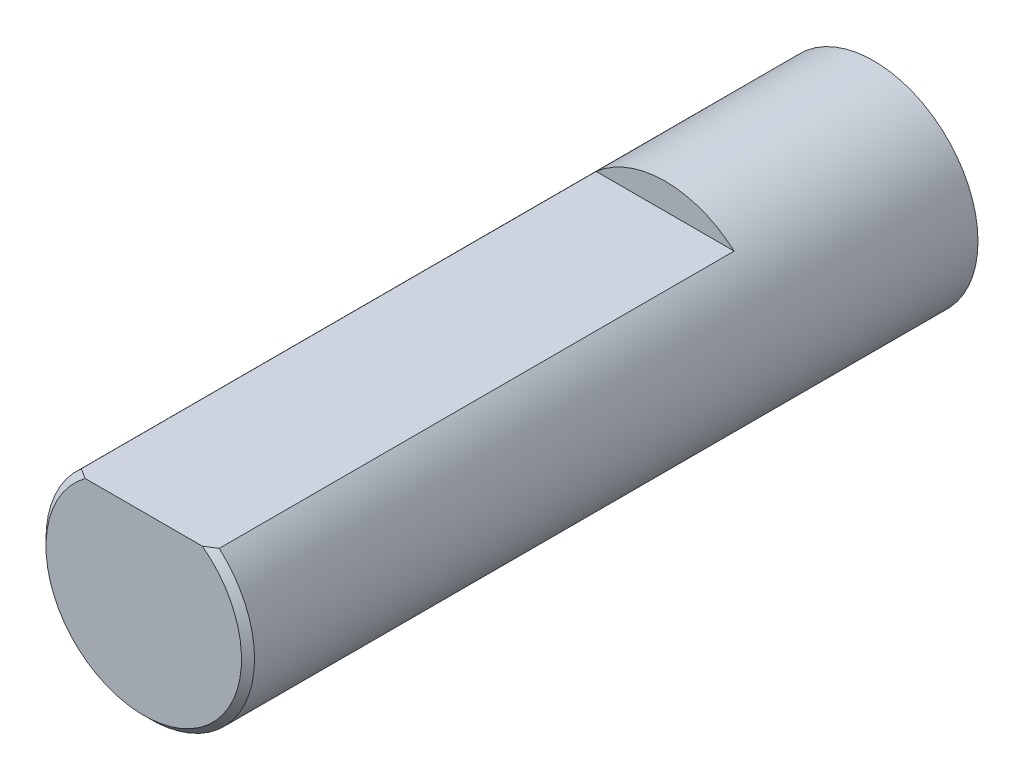
ISO-10303-21;
HEADER;
FILE_DESCRIPTION(('STEP AP214'),'2;1');
FILE_NAME('part.step','',(''),(''),'','','');
FILE_SCHEMA(('AUTOMOTIVE_DESIGN { 1 0 10303 214 1 1 1 1 }'));
ENDSEC;
DATA;
#1=APPLICATION_CONTEXT('core data for automotive mechanical design processes');
#2=APPLICATION_PROTOCOL_DEFINITION('international standard','automotive_design',2000,#1);
#3=PRODUCT_CONTEXT('',#1,'mechanical');
#4=PRODUCT('Part','Part','',(#3));
#5=PRODUCT_RELATED_PRODUCT_CATEGORY('part','',(#4));
#6=PRODUCT_DEFINITION_FORMATION('','',#4);
#7=PRODUCT_DEFINITION_CONTEXT('part definition',#1,'design');
#8=PRODUCT_DEFINITION('design','',#6,#7);
#9=PRODUCT_DEFINITION_SHAPE('','',#8);
#10=(LENGTH_UNIT() NAMED_UNIT(*) SI_UNIT(.MILLI.,.METRE.));
#11=(NAMED_UNIT(*) PLANE_ANGLE_UNIT() SI_UNIT($,.RADIAN.));
#12=(NAMED_UNIT(*) SI_UNIT($,.STERADIAN.) SOLID_ANGLE_UNIT());
#13=UNCERTAINTY_MEASURE_WITH_UNIT(LENGTH_MEASURE(1.E-05),#10,'distance_accuracy_value','');
#14=(GEOMETRIC_REPRESENTATION_CONTEXT(3) GLOBAL_UNCERTAINTY_ASSIGNED_CONTEXT((#13)) GLOBAL_UNIT_ASSIGNED_CONTEXT((#10,
#11,#12)) REPRESENTATION_CONTEXT('',''));
#15=CARTESIAN_POINT('',(0.,0.,0.));
#16=DIRECTION('',(0.,0.,1.));
#17=DIRECTION('',(1.,0.,0.));
#18=AXIS2_PLACEMENT_3D('',#15,#16,#17);
#19=CARTESIAN_POINT('',(0.,8.,-1.25));
#20=DIRECTION('',(0.,0.,1.));
#21=DIRECTION('',(1.,0.,0.));
#22=AXIS2_PLACEMENT_3D('',#19,#20,#21);
#23=PLANE('',#22);
#24=CARTESIAN_POINT('',(0.,8.,-1.25));
#25=DIRECTION('',(0.,0.,1.));
#26=DIRECTION('',(-1.,0.,0.));
#27=AXIS2_PLACEMENT_3D('',#24,#25,#26);
#28=CIRCLE('',#27,4.);
#29=CARTESIAN_POINT('',(4.,8.,-1.25));
#30=VERTEX_POINT('',#29);
#31=EDGE_CURVE('E37',#30,#30,#28,.T.);
#32=ORIENTED_EDGE('',*,*,#31,.F.);
#33=EDGE_LOOP('',(#32));
#34=FACE_BOUND('',#33,.T.);
#35=ADVANCED_FACE('F17',(#34),#23,.F.);
#36=CARTESIAN_POINT('',(0.,8.,26.75));
#37=DIRECTION('',(0.,0.,1.));
#38=DIRECTION('',(1.,0.,0.));
#39=AXIS2_PLACEMENT_3D('',#36,#37,#38);
#40=PLANE('',#39);
#41=CARTESIAN_POINT('',(0.,8.,26.75));
#42=DIRECTION('',(0.,0.,-1.));
#43=DIRECTION('',(-1.,0.,0.));
#44=AXIS2_PLACEMENT_3D('',#41,#42,#43);
#45=CIRCLE('',#44,3.75);
#46=CARTESIAN_POINT('',(2.25,11.,26.75));
#47=VERTEX_POINT('',#46);
#48=CARTESIAN_POINT('',(-2.25,11.,26.75));
#49=VERTEX_POINT('',#48);
#50=EDGE_CURVE('E90',#47,#49,#45,.T.);
#51=ORIENTED_EDGE('',*,*,#50,.F.);
#52=DIRECTION('',(-1.,0.,0.));
#53=VECTOR('',#52,1.);
#54=CARTESIAN_POINT('',(1.3228756555323,11.,26.75));
#55=LINE('',#54,#53);
#56=EDGE_CURVE('E11',#47,#49,#55,.T.);
#57=ORIENTED_EDGE('',*,*,#56,.T.);
#58=EDGE_LOOP('',(#51,#57));
#59=FACE_BOUND('',#58,.T.);
#60=ADVANCED_FACE('F134',(#59),#40,.T.);
#61=CARTESIAN_POINT('',(0.,11.5,6.75));
#62=DIRECTION('',(0.,0.,1.));
#63=DIRECTION('',(1.,0.,0.));
#64=AXIS2_PLACEMENT_3D('',#61,#62,#63);
#65=PLANE('',#64);
#66=DIRECTION('',(-1.,0.,0.));
#67=VECTOR('',#66,1.);
#68=CARTESIAN_POINT('',(-2.64575131106459,11.,6.75));
#69=LINE('',#68,#67);
#70=CARTESIAN_POINT('',(2.64575131106459,11.,6.75));
#71=VERTEX_POINT('',#70);
#72=CARTESIAN_POINT('',(-2.64575131106459,11.,6.75));
#73=VERTEX_POINT('',#72);
#74=EDGE_CURVE('E25',#71,#73,#69,.T.);
#75=ORIENTED_EDGE('',*,*,#74,.F.);
#76=CARTESIAN_POINT('',(0.,8.,6.75));
#77=DIRECTION('',(0.,0.,-1.));
#78=DIRECTION('',(-1.,0.,0.));
#79=AXIS2_PLACEMENT_3D('',#76,#77,#78);
#80=CIRCLE('',#79,4.);
#81=EDGE_CURVE('E77',#73,#71,#80,.T.);
#82=ORIENTED_EDGE('',*,*,#81,.F.);
#83=EDGE_LOOP('',(#75,#82));
#84=FACE_BOUND('',#83,.T.);
#85=ADVANCED_FACE('F117',(#84),#65,.T.);
#86=CARTESIAN_POINT('',(2.64575131106459,11.,26.75));
#87=DIRECTION('',(0.,-1.,0.));
#88=DIRECTION('',(0.,0.,-1.));
#89=AXIS2_PLACEMENT_3D('',#86,#87,#88);
#90=PLANE('',#89);
#91=CARTESIAN_POINT('',(2.64575131106459,11.,26.5));
#92=CARTESIAN_POINT('',(2.44149256986979,11.,26.6351044580781));
#93=CARTESIAN_POINT('',(2.25,11.,26.75));
#94=(BOUNDED_CURVE() B_SPLINE_CURVE(2,(#91,#92,#93),.UNSPECIFIED.,.F.,
.F.) B_SPLINE_CURVE_WITH_KNOTS((3,3),(2.79938337408154,2.92421286699696),
.UNSPECIFIED.) CURVE() GEOMETRIC_REPRESENTATION_ITEM() RATIONAL_B_SPLINE_CURVE((1.04757370527809,
1.02484755078438,1.)) REPRESENTATION_ITEM(''));
#95=CARTESIAN_POINT('',(2.64575131106459,11.,26.5));
#96=VERTEX_POINT('',#95);
#97=EDGE_CURVE('E83',#96,#47,#94,.T.);
#98=ORIENTED_EDGE('',*,*,#97,.F.);
#99=DIRECTION('',(0.,0.,1.));
#100=VECTOR('',#99,1.);
#101=CARTESIAN_POINT('',(2.64575131106459,11.,-1.25));
#102=LINE('',#101,#100);
#103=EDGE_CURVE('E69',#71,#96,#102,.T.);
#104=ORIENTED_EDGE('',*,*,#103,.F.);
#105=ORIENTED_EDGE('',*,*,#74,.T.);
#106=DIRECTION('',(0.,0.,-1.));
#107=VECTOR('',#106,1.);
#108=CARTESIAN_POINT('',(-2.64575131106459,11.,-1.25));
#109=LINE('',#108,#107);
#110=CARTESIAN_POINT('',(-2.64575131106459,11.,26.5));
#111=VERTEX_POINT('',#110);
#112=EDGE_CURVE('E106',#111,#73,#109,.T.);
#113=ORIENTED_EDGE('',*,*,#112,.F.);
#114=CARTESIAN_POINT('',(-2.25,11.,26.75));
#115=CARTESIAN_POINT('',(-2.44149256986996,11.,26.635104458078));
#116=CARTESIAN_POINT('',(-2.64575131106459,11.,26.5));
#117=(BOUNDED_CURVE() B_SPLINE_CURVE(2,(#114,#115,#116),.UNSPECIFIED.,.F.,
.F.) B_SPLINE_CURVE_WITH_KNOTS((3,3),(0.,0.124829492915321),
.UNSPECIFIED.) CURVE() GEOMETRIC_REPRESENTATION_ITEM() RATIONAL_B_SPLINE_CURVE((1.,
1.02484755078436,1.04757370527805)) REPRESENTATION_ITEM(''));
#118=EDGE_CURVE('E100',#49,#111,#117,.T.);
#119=ORIENTED_EDGE('',*,*,#118,.F.);
#120=ORIENTED_EDGE('',*,*,#56,.F.);
#121=EDGE_LOOP('',(#98,#104,#105,#113,#119,#120));
#122=FACE_BOUND('',#121,.T.);
#123=ADVANCED_FACE('F84',(#122),#90,.F.);
#124=CARTESIAN_POINT('',(0.,8.,-1.25));
#125=DIRECTION('',(0.,0.,1.));
#126=DIRECTION('',(-1.,0.,0.));
#127=AXIS2_PLACEMENT_3D('',#124,#125,#126);
#128=CYLINDRICAL_SURFACE('',#127,4.);
#129=CARTESIAN_POINT('',(0.,8.,26.5));
#130=DIRECTION('',(0.,0.,1.));
#131=DIRECTION('',(-1.,0.,0.));
#132=AXIS2_PLACEMENT_3D('',#129,#130,#131);
#133=CIRCLE('',#132,4.);
#134=CARTESIAN_POINT('',(4.,8.,26.5));
#135=VERTEX_POINT('',#134);
#136=EDGE_CURVE('E94',#111,#135,#133,.T.);
#137=ORIENTED_EDGE('',*,*,#136,.F.);
#138=ORIENTED_EDGE('',*,*,#112,.T.);
#139=ORIENTED_EDGE('',*,*,#81,.T.);
#140=ORIENTED_EDGE('',*,*,#103,.T.);
#141=CARTESIAN_POINT('',(0.,8.,26.5));
#142=DIRECTION('',(0.,0.,1.));
#143=DIRECTION('',(-1.,0.,0.));
#144=AXIS2_PLACEMENT_3D('',#141,#142,#143);
#145=CIRCLE('',#144,4.);
#146=EDGE_CURVE('E74',#135,#96,#145,.T.);
#147=ORIENTED_EDGE('',*,*,#146,.F.);
#148=DIRECTION('',(0.,0.,-1.));
#149=VECTOR('',#148,1.);
#150=CARTESIAN_POINT('',(4.,8.,-1.25));
#151=LINE('',#150,#149);
#152=EDGE_CURVE('E80',#135,#30,#151,.T.);
#153=ORIENTED_EDGE('',*,*,#152,.T.);
#154=ORIENTED_EDGE('',*,*,#31,.T.);
#155=ORIENTED_EDGE('',*,*,#152,.F.);
#156=EDGE_LOOP('',(#137,#138,#139,#140,#147,#153,#154,#155));
#157=FACE_BOUND('',#156,.T.);
#158=ADVANCED_FACE('F72',(#157),#128,.T.);
#159=CARTESIAN_POINT('',(0.,8.,26.625));
#160=DIRECTION('',(0.,0.,-1.));
#161=DIRECTION('',(0.,-1.,0.));
#162=AXIS2_PLACEMENT_3D('',#159,#160,#161);
#163=CONICAL_SURFACE('',#162,3.875,0.785398163397451);
#164=ORIENTED_EDGE('',*,*,#118,.T.);
#165=ORIENTED_EDGE('',*,*,#136,.T.);
#166=ORIENTED_EDGE('',*,*,#146,.T.);
#167=ORIENTED_EDGE('',*,*,#97,.T.);
#168=ORIENTED_EDGE('',*,*,#50,.T.);
#169=EDGE_LOOP('',(#164,#165,#166,#167,#168));
#170=FACE_BOUND('',#169,.T.);
#171=ADVANCED_FACE('F93',(#170),#163,.T.);
#172=CLOSED_SHELL('',(#35,#60,#85,#123,#158,#171));
#173=MANIFOLD_SOLID_BREP('B1',#172);
#174=ADVANCED_BREP_SHAPE_REPRESENTATION('',(#18,#173),#14);
#175=SHAPE_DEFINITION_REPRESENTATION(#9,#174);
ENDSEC;
END-ISO-10303-21;
